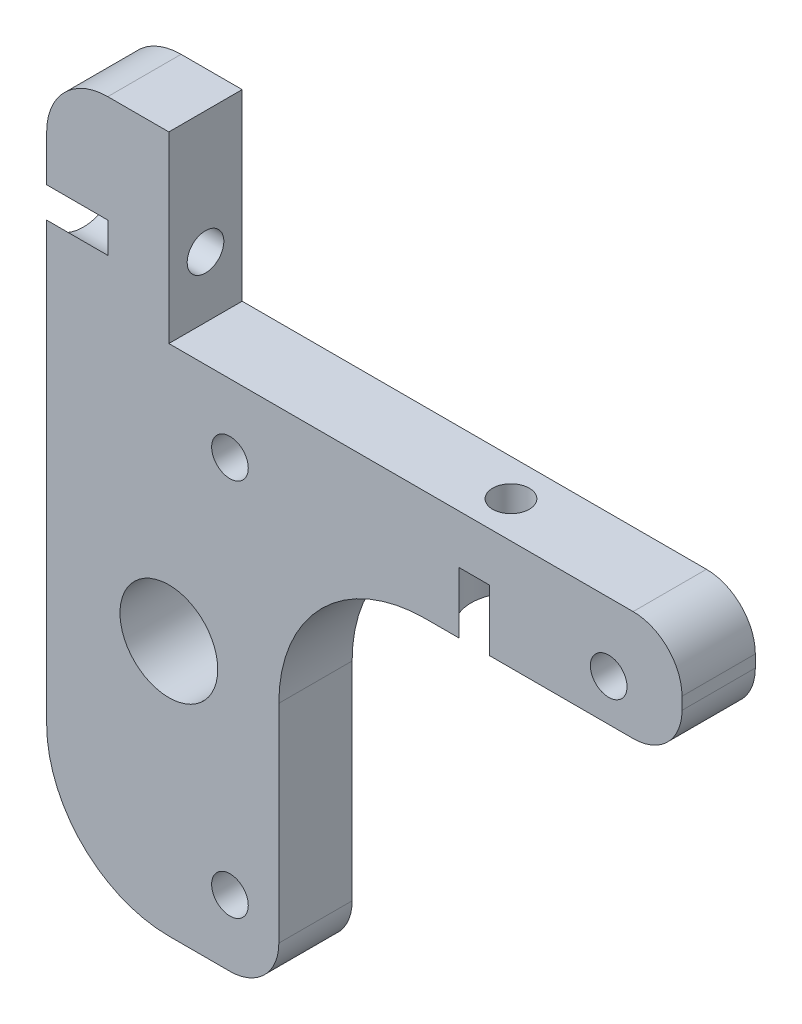
ISO-10303-21;
HEADER;
FILE_DESCRIPTION(('STEP AP214'),'2;1');
FILE_NAME('part.step','',(''),(''),'','','');
FILE_SCHEMA(('AUTOMOTIVE_DESIGN { 1 0 10303 214 1 1 1 1 }'));
ENDSEC;
DATA;
#1=APPLICATION_CONTEXT('core data for automotive mechanical design processes');
#2=APPLICATION_PROTOCOL_DEFINITION('international standard','automotive_design',2000,#1);
#3=PRODUCT_CONTEXT('',#1,'mechanical');
#4=PRODUCT('Part','Part','',(#3));
#5=PRODUCT_RELATED_PRODUCT_CATEGORY('part','',(#4));
#6=PRODUCT_DEFINITION_FORMATION('','',#4);
#7=PRODUCT_DEFINITION_CONTEXT('part definition',#1,'design');
#8=PRODUCT_DEFINITION('design','',#6,#7);
#9=PRODUCT_DEFINITION_SHAPE('','',#8);
#10=(LENGTH_UNIT() NAMED_UNIT(*) SI_UNIT(.MILLI.,.METRE.));
#11=(NAMED_UNIT(*) PLANE_ANGLE_UNIT() SI_UNIT($,.RADIAN.));
#12=(NAMED_UNIT(*) SI_UNIT($,.STERADIAN.) SOLID_ANGLE_UNIT());
#13=UNCERTAINTY_MEASURE_WITH_UNIT(LENGTH_MEASURE(1.E-05),#10,'distance_accuracy_value','');
#14=(GEOMETRIC_REPRESENTATION_CONTEXT(3) GLOBAL_UNCERTAINTY_ASSIGNED_CONTEXT((#13)) GLOBAL_UNIT_ASSIGNED_CONTEXT((#10,
#11,#12)) REPRESENTATION_CONTEXT('',''));
#15=CARTESIAN_POINT('',(0.,0.,0.));
#16=DIRECTION('',(0.,0.,1.));
#17=DIRECTION('',(1.,0.,0.));
#18=AXIS2_PLACEMENT_3D('',#15,#16,#17);
#19=CARTESIAN_POINT('',(-9.99999999999999,-31.9999999999999,6.));
#20=DIRECTION('',(1.,0.,0.));
#21=DIRECTION('',(0.,1.,0.));
#22=AXIS2_PLACEMENT_3D('',#19,#20,#21);
#23=PLANE('',#22);
#24=DIRECTION('',(0.,-1.,0.));
#25=VECTOR('',#24,1.);
#26=CARTESIAN_POINT('',(-9.99999999999999,-31.9999999999999,6.));
#27=LINE('',#26,#25);
#28=CARTESIAN_POINT('',(-9.99999999999999,3.75,6.));
#29=VERTEX_POINT('',#28);
#30=CARTESIAN_POINT('',(-10.,-31.9999999999999,6.));
#31=VERTEX_POINT('',#30);
#32=EDGE_CURVE('E343',#29,#31,#27,.T.);
#33=ORIENTED_EDGE('',*,*,#32,.F.);
#34=CARTESIAN_POINT('',(-9.99999999999999,5.,3.));
#35=DIRECTION('',(-1.,0.,0.));
#36=DIRECTION('',(0.,0.,1.));
#37=AXIS2_PLACEMENT_3D('',#34,#35,#36);
#38=CIRCLE('',#37,3.25);
#39=CARTESIAN_POINT('',(-9.99999999999999,3.75,0.));
#40=VERTEX_POINT('',#39);
#41=EDGE_CURVE('E193',#40,#29,#38,.T.);
#42=ORIENTED_EDGE('',*,*,#41,.F.);
#43=DIRECTION('',(0.,-1.,0.));
#44=VECTOR('',#43,1.);
#45=CARTESIAN_POINT('',(-9.99999999999999,-31.9999999999999,0.));
#46=LINE('',#45,#44);
#47=CARTESIAN_POINT('',(-10.,-31.9999999999999,0.));
#48=VERTEX_POINT('',#47);
#49=EDGE_CURVE('E212',#40,#48,#46,.T.);
#50=ORIENTED_EDGE('',*,*,#49,.T.);
#51=DIRECTION('',(0.,0.,-1.));
#52=VECTOR('',#51,1.);
#53=CARTESIAN_POINT('',(-10.,-31.9999999999999,6.));
#54=LINE('',#53,#52);
#55=EDGE_CURVE('E271',#31,#48,#54,.T.);
#56=ORIENTED_EDGE('',*,*,#55,.F.);
#57=EDGE_LOOP('',(#33,#42,#50,#56));
#58=FACE_BOUND('',#57,.T.);
#59=ADVANCED_FACE('F33',(#58),#23,.F.);
#60=CARTESIAN_POINT('',(42.,5.,3.));
#61=DIRECTION('',(-1.,0.,0.));
#62=DIRECTION('',(0.,0.,1.));
#63=AXIS2_PLACEMENT_3D('',#60,#61,#62);
#64=CYLINDRICAL_SURFACE('',#63,1.5);
#65=CARTESIAN_POINT('',(0.,5.,3.));
#66=DIRECTION('',(-1.,0.,0.));
#67=DIRECTION('',(0.,-1.,0.));
#68=AXIS2_PLACEMENT_3D('',#65,#66,#67);
#69=CIRCLE('',#68,1.5);
#70=CARTESIAN_POINT('',(0.,5.,4.5));
#71=VERTEX_POINT('',#70);
#72=EDGE_CURVE('E280',#71,#71,#69,.T.);
#73=CARTESIAN_POINT('',(-4.99999999999999,5.,3.));
#74=DIRECTION('',(-1.,0.,0.));
#75=DIRECTION('',(0.,0.,1.));
#76=AXIS2_PLACEMENT_3D('',#73,#74,#75);
#77=CIRCLE('',#76,1.5);
#78=CARTESIAN_POINT('',(-4.99999999999999,5.,4.5));
#79=VERTEX_POINT('',#78);
#80=EDGE_CURVE('E37',#79,#79,#77,.F.);
#81=CARTESIAN_POINT('',(0.,5.,4.5));
#82=CARTESIAN_POINT('',(-0.0520833333333322,5.,4.5));
#83=CARTESIAN_POINT('',(-0.104166666666664,5.,4.5));
#84=CARTESIAN_POINT('',(-0.208333333333331,5.,4.5));
#85=CARTESIAN_POINT('',(-0.260416666666666,5.,4.5));
#86=CARTESIAN_POINT('',(-0.364583333333332,5.,4.5));
#87=CARTESIAN_POINT('',(-0.416666666666665,5.,4.5));
#88=CARTESIAN_POINT('',(-0.520833333333331,5.,4.5));
#89=CARTESIAN_POINT('',(-0.572916666666666,5.,4.5));
#90=CARTESIAN_POINT('',(-0.677083333333333,5.,4.5));
#91=CARTESIAN_POINT('',(-0.729166666666665,5.,4.5));
#92=CARTESIAN_POINT('',(-0.833333333333332,5.,4.5));
#93=CARTESIAN_POINT('',(-0.885416666666666,5.,4.5));
#94=CARTESIAN_POINT('',(-0.989583333333333,5.,4.5));
#95=CARTESIAN_POINT('',(-1.04166666666667,5.,4.5));
#96=CARTESIAN_POINT('',(-1.14583333333333,5.,4.5));
#97=CARTESIAN_POINT('',(-1.19791666666667,5.,4.5));
#98=CARTESIAN_POINT('',(-1.30208333333333,5.,4.5));
#99=CARTESIAN_POINT('',(-1.35416666666667,5.,4.5));
#100=CARTESIAN_POINT('',(-1.45833333333333,5.,4.5));
#101=CARTESIAN_POINT('',(-1.51041666666666,5.,4.5));
#102=CARTESIAN_POINT('',(-1.61458333333333,5.,4.5));
#103=CARTESIAN_POINT('',(-1.66666666666666,5.,4.5));
#104=CARTESIAN_POINT('',(-1.77083333333333,5.,4.5));
#105=CARTESIAN_POINT('',(-1.82291666666666,5.,4.5));
#106=CARTESIAN_POINT('',(-1.92708333333333,5.,4.5));
#107=CARTESIAN_POINT('',(-1.97916666666666,5.,4.5));
#108=CARTESIAN_POINT('',(-2.08333333333333,5.,4.5));
#109=CARTESIAN_POINT('',(-2.13541666666666,5.,4.5));
#110=CARTESIAN_POINT('',(-2.23958333333333,5.,4.5));
#111=CARTESIAN_POINT('',(-2.29166666666666,5.,4.5));
#112=CARTESIAN_POINT('',(-2.39583333333333,5.,4.5));
#113=CARTESIAN_POINT('',(-2.44791666666666,5.,4.5));
#114=CARTESIAN_POINT('',(-2.55208333333333,5.,4.5));
#115=CARTESIAN_POINT('',(-2.60416666666666,5.,4.5));
#116=CARTESIAN_POINT('',(-2.70833333333333,5.,4.5));
#117=CARTESIAN_POINT('',(-2.76041666666666,5.,4.5));
#118=CARTESIAN_POINT('',(-2.86458333333333,5.,4.5));
#119=CARTESIAN_POINT('',(-2.91666666666666,5.,4.5));
#120=CARTESIAN_POINT('',(-3.02083333333333,5.,4.5));
#121=CARTESIAN_POINT('',(-3.07291666666666,5.,4.5));
#122=CARTESIAN_POINT('',(-3.17708333333333,5.,4.5));
#123=CARTESIAN_POINT('',(-3.22916666666666,5.,4.5));
#124=CARTESIAN_POINT('',(-3.33333333333333,5.,4.5));
#125=CARTESIAN_POINT('',(-3.38541666666666,5.,4.5));
#126=CARTESIAN_POINT('',(-3.48958333333333,5.,4.5));
#127=CARTESIAN_POINT('',(-3.54166666666666,5.,4.5));
#128=CARTESIAN_POINT('',(-3.64583333333333,5.,4.5));
#129=CARTESIAN_POINT('',(-3.69791666666666,5.,4.5));
#130=CARTESIAN_POINT('',(-3.80208333333332,5.,4.5));
#131=CARTESIAN_POINT('',(-3.85416666666666,5.,4.5));
#132=CARTESIAN_POINT('',(-3.95833333333333,5.,4.5));
#133=CARTESIAN_POINT('',(-4.01041666666666,5.,4.5));
#134=CARTESIAN_POINT('',(-4.11458333333332,5.,4.5));
#135=CARTESIAN_POINT('',(-4.16666666666666,5.,4.5));
#136=CARTESIAN_POINT('',(-4.27083333333333,5.,4.5));
#137=CARTESIAN_POINT('',(-4.32291666666666,5.,4.5));
#138=CARTESIAN_POINT('',(-4.42708333333332,5.,4.5));
#139=CARTESIAN_POINT('',(-4.47916666666666,5.,4.5));
#140=CARTESIAN_POINT('',(-4.58333333333333,5.,4.5));
#141=CARTESIAN_POINT('',(-4.63541666666666,5.,4.5));
#142=CARTESIAN_POINT('',(-4.73958333333333,5.,4.5));
#143=CARTESIAN_POINT('',(-4.79166666666666,5.,4.5));
#144=CARTESIAN_POINT('',(-4.89583333333333,5.,4.5));
#145=CARTESIAN_POINT('',(-4.94791666666666,5.,4.5));
#146=CARTESIAN_POINT('',(-4.99999999999999,5.,4.5));
#147=B_SPLINE_CURVE_WITH_KNOTS('',3,(#81,#82,#83,#84,#85,#86,#87,#88,#89,#90,#91,#92,#93,#94,
#95,#96,#97,#98,#99,#100,#101,#102,#103,#104,#105,#106,#107,#108,#109,#110,#111,#112,#113,#114,
#115,#116,#117,#118,#119,#120,#121,#122,#123,#124,#125,#126,#127,#128,#129,#130,#131,#132,#133,
#134,#135,#136,#137,#138,#139,#140,#141,#142,#143,#144,#145,#146),.UNSPECIFIED.,.F.,.F.,(4,2,2,
2,2,2,2,2,2,2,2,2,2,2,2,2,2,2,2,2,2,2,2,2,2,2,2,2,2,2,2,2,4),(0.,0.156249999999997,0.3125,
0.468749999999997,0.625000000000001,0.781249999999997,0.937500000000001,1.09375,1.25,1.40625,
1.56249999999999,1.71875,1.87499999999999,2.03125,2.1875,2.34375,2.5,2.65624999999999,2.8125,
2.96874999999999,3.125,3.28124999999999,3.4375,3.59374999999999,3.74999999999999,
3.90624999999999,4.06249999999999,4.21874999999999,4.37499999999999,4.53124999999999,
4.68749999999999,4.84374999999999,4.99999999999999),.UNSPECIFIED.);
#148=EDGE_CURVE('BSEAM467',#71,#79,#147,.T.);
#149=ORIENTED_EDGE('',*,*,#72,.F.);
#150=ORIENTED_EDGE('',*,*,#80,.F.);
#151=ORIENTED_EDGE('',*,*,#148,.T.);
#152=ORIENTED_EDGE('',*,*,#148,.F.);
#153=EDGE_LOOP('',(#149,#151,#150,#152));
#154=FACE_BOUND('',#153,.T.);
#155=ADVANCED_FACE('F467',(#154),#64,.F.);
#156=CARTESIAN_POINT('',(38.,-9.,6.));
#157=DIRECTION('',(0.,1.,0.));
#158=DIRECTION('',(-1.,0.,0.));
#159=AXIS2_PLACEMENT_3D('',#156,#157,#158);
#160=PLANE('',#159);
#161=DIRECTION('',(1.,0.,0.));
#162=VECTOR('',#161,1.);
#163=CARTESIAN_POINT('',(38.,-9.,6.));
#164=LINE('',#163,#162);
#165=CARTESIAN_POINT('',(26.25,-9.,6.));
#166=VERTEX_POINT('',#165);
#167=CARTESIAN_POINT('',(38.,-9.,6.));
#168=VERTEX_POINT('',#167);
#169=EDGE_CURVE('E356',#166,#168,#164,.T.);
#170=ORIENTED_EDGE('',*,*,#169,.F.);
#171=CARTESIAN_POINT('',(25.,-9.,3.));
#172=DIRECTION('',(0.,-1.,0.));
#173=DIRECTION('',(1.,0.,0.));
#174=AXIS2_PLACEMENT_3D('',#171,#172,#173);
#175=CIRCLE('',#174,3.25);
#176=CARTESIAN_POINT('',(26.25,-9.,0.));
#177=VERTEX_POINT('',#176);
#178=EDGE_CURVE('E300',#177,#166,#175,.T.);
#179=ORIENTED_EDGE('',*,*,#178,.F.);
#180=DIRECTION('',(1.,0.,0.));
#181=VECTOR('',#180,1.);
#182=CARTESIAN_POINT('',(38.,-9.,0.));
#183=LINE('',#182,#181);
#184=CARTESIAN_POINT('',(38.,-9.,0.));
#185=VERTEX_POINT('',#184);
#186=EDGE_CURVE('E227',#177,#185,#183,.T.);
#187=ORIENTED_EDGE('',*,*,#186,.T.);
#188=DIRECTION('',(0.,0.,-1.));
#189=VECTOR('',#188,1.);
#190=CARTESIAN_POINT('',(38.,-9.,6.));
#191=LINE('',#190,#189);
#192=EDGE_CURVE('E253',#168,#185,#191,.T.);
#193=ORIENTED_EDGE('',*,*,#192,.F.);
#194=EDGE_LOOP('',(#170,#179,#187,#193));
#195=FACE_BOUND('',#194,.T.);
#196=ADVANCED_FACE('F405',(#195),#160,.F.);
#197=CARTESIAN_POINT('',(25.,15.,3.));
#198=DIRECTION('',(0.,-1.,0.));
#199=DIRECTION('',(1.,0.,0.));
#200=AXIS2_PLACEMENT_3D('',#197,#198,#199);
#201=CYLINDRICAL_SURFACE('',#200,1.5);
#202=CARTESIAN_POINT('',(25.,0.,3.));
#203=DIRECTION('',(0.,-1.,0.));
#204=DIRECTION('',(0.,0.,-1.));
#205=AXIS2_PLACEMENT_3D('',#202,#203,#204);
#206=CIRCLE('',#205,1.5);
#207=CARTESIAN_POINT('',(25.,0.,1.5));
#208=VERTEX_POINT('',#207);
#209=EDGE_CURVE('E277',#208,#208,#206,.T.);
#210=ORIENTED_EDGE('',*,*,#209,.F.);
#211=EDGE_LOOP('',(#210));
#212=FACE_BOUND('',#211,.T.);
#213=CARTESIAN_POINT('',(25.,-4.,3.));
#214=DIRECTION('',(0.,-1.,0.));
#215=DIRECTION('',(1.,0.,0.));
#216=AXIS2_PLACEMENT_3D('',#213,#214,#215);
#217=CIRCLE('',#216,1.5);
#218=CARTESIAN_POINT('',(26.5,-4.,3.));
#219=VERTEX_POINT('',#218);
#220=EDGE_CURVE('E281',#219,#219,#217,.F.);
#221=ORIENTED_EDGE('',*,*,#220,.F.);
#222=EDGE_LOOP('',(#221));
#223=FACE_BOUND('',#222,.T.);
#224=ADVANCED_FACE('F475',(#212,#223),#201,.F.);
#225=CARTESIAN_POINT('',(38.,-4.,6.));
#226=DIRECTION('',(0.,0.,-1.));
#227=DIRECTION('',(-1.,0.,0.));
#228=AXIS2_PLACEMENT_3D('',#225,#226,#227);
#229=PLANE('',#228);
#230=CARTESIAN_POINT('',(5.,-36.58,6.));
#231=DIRECTION('',(0.,0.,1.));
#232=DIRECTION('',(1.,0.,0.));
#233=AXIS2_PLACEMENT_3D('',#230,#231,#232);
#234=CIRCLE('',#233,1.5);
#235=CARTESIAN_POINT('',(6.5,-36.58,6.));
#236=VERTEX_POINT('',#235);
#237=EDGE_CURVE('E319',#236,#236,#234,.T.);
#238=ORIENTED_EDGE('',*,*,#237,.F.);
#239=EDGE_LOOP('',(#238));
#240=FACE_BOUND('',#239,.T.);
#241=CARTESIAN_POINT('',(36.,-5.57999999999999,6.));
#242=DIRECTION('',(0.,0.,1.));
#243=DIRECTION('',(1.,0.,0.));
#244=AXIS2_PLACEMENT_3D('',#241,#242,#243);
#245=CIRCLE('',#244,1.5);
#246=CARTESIAN_POINT('',(37.5,-5.57999999999999,6.));
#247=VERTEX_POINT('',#246);
#248=EDGE_CURVE('E331',#247,#247,#245,.T.);
#249=ORIENTED_EDGE('',*,*,#248,.F.);
#250=EDGE_LOOP('',(#249));
#251=FACE_BOUND('',#250,.T.);
#252=DIRECTION('',(0.,1.,0.));
#253=VECTOR('',#252,1.);
#254=CARTESIAN_POINT('',(-4.99999999999999,-4.,6.));
#255=LINE('',#254,#253);
#256=CARTESIAN_POINT('',(-4.99999999999999,3.75,6.));
#257=VERTEX_POINT('',#256);
#258=CARTESIAN_POINT('',(-4.99999999999999,6.25,6.));
#259=VERTEX_POINT('',#258);
#260=EDGE_CURVE('E205',#257,#259,#255,.T.);
#261=ORIENTED_EDGE('',*,*,#260,.F.);
#262=DIRECTION('',(-1.,0.,0.));
#263=VECTOR('',#262,1.);
#264=CARTESIAN_POINT('',(-4.99999999999999,3.75,6.));
#265=LINE('',#264,#263);
#266=EDGE_CURVE('E298',#257,#29,#265,.T.);
#267=ORIENTED_EDGE('',*,*,#266,.T.);
#268=ORIENTED_EDGE('',*,*,#32,.T.);
#269=CARTESIAN_POINT('',(0.,-32.,6.));
#270=DIRECTION('',(0.,0.,1.));
#271=DIRECTION('',(-1.,0.,0.));
#272=AXIS2_PLACEMENT_3D('',#269,#270,#271);
#273=CIRCLE('',#272,10.);
#274=CARTESIAN_POINT('',(0.,-42.,6.));
#275=VERTEX_POINT('',#274);
#276=EDGE_CURVE('E346',#31,#275,#273,.T.);
#277=ORIENTED_EDGE('',*,*,#276,.T.);
#278=DIRECTION('',(1.,0.,0.));
#279=VECTOR('',#278,1.);
#280=CARTESIAN_POINT('',(5.00000000000001,-42.,6.));
#281=LINE('',#280,#279);
#282=CARTESIAN_POINT('',(5.00000000000001,-42.,6.));
#283=VERTEX_POINT('',#282);
#284=EDGE_CURVE('E348',#275,#283,#281,.T.);
#285=ORIENTED_EDGE('',*,*,#284,.T.);
#286=CARTESIAN_POINT('',(5.00000000000001,-38.,6.));
#287=DIRECTION('',(0.,0.,1.));
#288=DIRECTION('',(-1.,0.,0.));
#289=AXIS2_PLACEMENT_3D('',#286,#287,#288);
#290=CIRCLE('',#289,4.);
#291=CARTESIAN_POINT('',(9.00000000000001,-38.,6.));
#292=VERTEX_POINT('',#291);
#293=EDGE_CURVE('E350',#283,#292,#290,.T.);
#294=ORIENTED_EDGE('',*,*,#293,.T.);
#295=DIRECTION('',(0.,1.,0.));
#296=VECTOR('',#295,1.);
#297=CARTESIAN_POINT('',(9.00000000000001,-21.,6.));
#298=LINE('',#297,#296);
#299=CARTESIAN_POINT('',(9.00000000000001,-21.,6.));
#300=VERTEX_POINT('',#299);
#301=EDGE_CURVE('E352',#292,#300,#298,.T.);
#302=ORIENTED_EDGE('',*,*,#301,.T.);
#303=CARTESIAN_POINT('',(21.,-21.,6.));
#304=DIRECTION('',(0.,0.,-1.));
#305=DIRECTION('',(-1.,0.,0.));
#306=AXIS2_PLACEMENT_3D('',#303,#304,#305);
#307=CIRCLE('',#306,12.);
#308=CARTESIAN_POINT('',(21.,-9.,6.));
#309=VERTEX_POINT('',#308);
#310=EDGE_CURVE('E354',#300,#309,#307,.T.);
#311=ORIENTED_EDGE('',*,*,#310,.T.);
#312=CARTESIAN_POINT('',(23.75,-9.,6.));
#313=VERTEX_POINT('',#312);
#314=EDGE_CURVE('E357',#309,#313,#164,.T.);
#315=ORIENTED_EDGE('',*,*,#314,.T.);
#316=DIRECTION('',(0.,-1.,0.));
#317=VECTOR('',#316,1.);
#318=CARTESIAN_POINT('',(23.75,-4.,6.));
#319=LINE('',#318,#317);
#320=CARTESIAN_POINT('',(23.75,-4.,6.));
#321=VERTEX_POINT('',#320);
#322=EDGE_CURVE('E58',#313,#321,#319,.F.);
#323=ORIENTED_EDGE('',*,*,#322,.T.);
#324=DIRECTION('',(-1.,0.,0.));
#325=VECTOR('',#324,1.);
#326=CARTESIAN_POINT('',(38.,-4.,6.));
#327=LINE('',#326,#325);
#328=CARTESIAN_POINT('',(26.25,-4.,6.));
#329=VERTEX_POINT('',#328);
#330=EDGE_CURVE('E288',#329,#321,#327,.T.);
#331=ORIENTED_EDGE('',*,*,#330,.F.);
#332=DIRECTION('',(0.,-1.,0.));
#333=VECTOR('',#332,1.);
#334=CARTESIAN_POINT('',(26.25,-4.,6.));
#335=LINE('',#334,#333);
#336=EDGE_CURVE('E308',#329,#166,#335,.T.);
#337=ORIENTED_EDGE('',*,*,#336,.T.);
#338=ORIENTED_EDGE('',*,*,#169,.T.);
#339=CARTESIAN_POINT('',(38.,-5.,6.));
#340=DIRECTION('',(0.,0.,1.));
#341=DIRECTION('',(-1.,0.,0.));
#342=AXIS2_PLACEMENT_3D('',#339,#340,#341);
#343=CIRCLE('',#342,4.);
#344=CARTESIAN_POINT('',(42.,-5.,6.));
#345=VERTEX_POINT('',#344);
#346=EDGE_CURVE('E360',#168,#345,#343,.T.);
#347=ORIENTED_EDGE('',*,*,#346,.T.);
#348=DIRECTION('',(0.,1.,0.));
#349=VECTOR('',#348,1.);
#350=CARTESIAN_POINT('',(42.,-4.00000000000003,6.));
#351=LINE('',#350,#349);
#352=CARTESIAN_POINT('',(42.,-4.00000000000003,6.));
#353=VERTEX_POINT('',#352);
#354=EDGE_CURVE('E362',#345,#353,#351,.T.);
#355=ORIENTED_EDGE('',*,*,#354,.T.);
#356=CARTESIAN_POINT('',(38.,-4.,6.));
#357=DIRECTION('',(0.,0.,1.));
#358=DIRECTION('',(-1.,0.,0.));
#359=AXIS2_PLACEMENT_3D('',#356,#357,#358);
#360=CIRCLE('',#359,4.);
#361=CARTESIAN_POINT('',(38.,0.,6.));
#362=VERTEX_POINT('',#361);
#363=EDGE_CURVE('E364',#353,#362,#360,.T.);
#364=ORIENTED_EDGE('',*,*,#363,.T.);
#365=DIRECTION('',(-1.,0.,0.));
#366=VECTOR('',#365,1.);
#367=CARTESIAN_POINT('',(0.,0.,6.));
#368=LINE('',#367,#366);
#369=CARTESIAN_POINT('',(0.,0.,6.));
#370=VERTEX_POINT('',#369);
#371=EDGE_CURVE('E244',#362,#370,#368,.T.);
#372=ORIENTED_EDGE('',*,*,#371,.T.);
#373=DIRECTION('',(0.,1.,0.));
#374=VECTOR('',#373,1.);
#375=CARTESIAN_POINT('',(0.,15.,6.));
#376=LINE('',#375,#374);
#377=CARTESIAN_POINT('',(0.,15.,6.));
#378=VERTEX_POINT('',#377);
#379=EDGE_CURVE('E239',#370,#378,#376,.T.);
#380=ORIENTED_EDGE('',*,*,#379,.T.);
#381=DIRECTION('',(-1.,0.,0.));
#382=VECTOR('',#381,1.);
#383=CARTESIAN_POINT('',(-4.99999999999996,15.,6.));
#384=LINE('',#383,#382);
#385=CARTESIAN_POINT('',(-4.99999999999996,15.,6.));
#386=VERTEX_POINT('',#385);
#387=EDGE_CURVE('E339',#378,#386,#384,.T.);
#388=ORIENTED_EDGE('',*,*,#387,.T.);
#389=CARTESIAN_POINT('',(-4.99999999999999,10.,6.));
#390=DIRECTION('',(0.,0.,1.));
#391=DIRECTION('',(-1.,0.,0.));
#392=AXIS2_PLACEMENT_3D('',#389,#390,#391);
#393=CIRCLE('',#392,5.);
#394=CARTESIAN_POINT('',(-9.99999999999999,9.99999999999996,6.));
#395=VERTEX_POINT('',#394);
#396=EDGE_CURVE('E341',#386,#395,#393,.T.);
#397=ORIENTED_EDGE('',*,*,#396,.T.);
#398=CARTESIAN_POINT('',(-9.99999999999999,6.25,6.));
#399=VERTEX_POINT('',#398);
#400=EDGE_CURVE('E344',#395,#399,#27,.T.);
#401=ORIENTED_EDGE('',*,*,#400,.T.);
#402=DIRECTION('',(-1.,0.,0.));
#403=VECTOR('',#402,1.);
#404=CARTESIAN_POINT('',(-4.99999999999999,6.25,6.));
#405=LINE('',#404,#403);
#406=EDGE_CURVE('E50',#399,#259,#405,.F.);
#407=ORIENTED_EDGE('',*,*,#406,.T.);
#408=EDGE_LOOP('',(#261,#267,#268,#277,#285,#294,#302,#311,#315,#323,#331,#337,#338,#347,#355,
#364,#372,#380,#388,#397,#401,#407));
#409=FACE_BOUND('',#408,.T.);
#410=CARTESIAN_POINT('',(5.,-5.58,6.));
#411=DIRECTION('',(0.,0.,1.));
#412=DIRECTION('',(1.,0.,0.));
#413=AXIS2_PLACEMENT_3D('',#410,#411,#412);
#414=CIRCLE('',#413,1.5);
#415=CARTESIAN_POINT('',(6.5,-5.58,6.));
#416=VERTEX_POINT('',#415);
#417=EDGE_CURVE('E325',#416,#416,#414,.T.);
#418=ORIENTED_EDGE('',*,*,#417,.F.);
#419=EDGE_LOOP('',(#418));
#420=FACE_BOUND('',#419,.T.);
#421=CARTESIAN_POINT('',(0.,-21.1,6.));
#422=DIRECTION('',(0.,0.,1.));
#423=DIRECTION('',(1.,0.,0.));
#424=AXIS2_PLACEMENT_3D('',#421,#422,#423);
#425=CIRCLE('',#424,4.);
#426=CARTESIAN_POINT('',(4.,-21.1,6.));
#427=VERTEX_POINT('',#426);
#428=EDGE_CURVE('E313',#427,#427,#425,.T.);
#429=ORIENTED_EDGE('',*,*,#428,.F.);
#430=EDGE_LOOP('',(#429));
#431=FACE_BOUND('',#430,.T.);
#432=ADVANCED_FACE('F412',(#240,#251,#409,#420,#431),#229,.F.);
#433=CARTESIAN_POINT('',(38.,-4.,0.));
#434=DIRECTION('',(0.,0.,-1.));
#435=DIRECTION('',(-1.,0.,0.));
#436=AXIS2_PLACEMENT_3D('',#433,#434,#435);
#437=PLANE('',#436);
#438=DIRECTION('',(-1.,0.,0.));
#439=VECTOR('',#438,1.);
#440=CARTESIAN_POINT('',(-4.99999999999999,3.75,0.));
#441=LINE('',#440,#439);
#442=CARTESIAN_POINT('',(-4.99999999999999,3.75,0.));
#443=VERTEX_POINT('',#442);
#444=EDGE_CURVE('E204',#443,#40,#441,.T.);
#445=ORIENTED_EDGE('',*,*,#444,.F.);
#446=DIRECTION('',(0.,1.,0.));
#447=VECTOR('',#446,1.);
#448=CARTESIAN_POINT('',(-4.99999999999999,-4.,0.));
#449=LINE('',#448,#447);
#450=CARTESIAN_POINT('',(-4.99999999999999,6.25,0.));
#451=VERTEX_POINT('',#450);
#452=EDGE_CURVE('E203',#443,#451,#449,.T.);
#453=ORIENTED_EDGE('',*,*,#452,.T.);
#454=DIRECTION('',(-1.,0.,0.));
#455=VECTOR('',#454,1.);
#456=CARTESIAN_POINT('',(-4.99999999999999,6.25,0.));
#457=LINE('',#456,#455);
#458=CARTESIAN_POINT('',(-9.99999999999999,6.25,0.));
#459=VERTEX_POINT('',#458);
#460=EDGE_CURVE('E186',#459,#451,#457,.F.);
#461=ORIENTED_EDGE('',*,*,#460,.F.);
#462=CARTESIAN_POINT('',(-9.99999999999999,9.99999999999996,0.));
#463=VERTEX_POINT('',#462);
#464=EDGE_CURVE('E202',#463,#459,#46,.T.);
#465=ORIENTED_EDGE('',*,*,#464,.F.);
#466=CARTESIAN_POINT('',(-4.99999999999999,10.,0.));
#467=DIRECTION('',(0.,0.,1.));
#468=DIRECTION('',(-1.,0.,0.));
#469=AXIS2_PLACEMENT_3D('',#466,#467,#468);
#470=CIRCLE('',#469,5.);
#471=CARTESIAN_POINT('',(-4.99999999999996,15.,0.));
#472=VERTEX_POINT('',#471);
#473=EDGE_CURVE('E216',#472,#463,#470,.T.);
#474=ORIENTED_EDGE('',*,*,#473,.F.);
#475=DIRECTION('',(-1.,0.,0.));
#476=VECTOR('',#475,1.);
#477=CARTESIAN_POINT('',(-4.99999999999996,15.,0.));
#478=LINE('',#477,#476);
#479=CARTESIAN_POINT('',(0.,15.,0.));
#480=VERTEX_POINT('',#479);
#481=EDGE_CURVE('E368',#480,#472,#478,.T.);
#482=ORIENTED_EDGE('',*,*,#481,.F.);
#483=DIRECTION('',(0.,1.,0.));
#484=VECTOR('',#483,1.);
#485=CARTESIAN_POINT('',(0.,15.,0.));
#486=LINE('',#485,#484);
#487=CARTESIAN_POINT('',(0.,0.,0.));
#488=VERTEX_POINT('',#487);
#489=EDGE_CURVE('E334',#488,#480,#486,.T.);
#490=ORIENTED_EDGE('',*,*,#489,.F.);
#491=DIRECTION('',(-1.,0.,0.));
#492=VECTOR('',#491,1.);
#493=CARTESIAN_POINT('',(0.,0.,0.));
#494=LINE('',#493,#492);
#495=CARTESIAN_POINT('',(38.,0.,0.));
#496=VERTEX_POINT('',#495);
#497=EDGE_CURVE('E237',#496,#488,#494,.T.);
#498=ORIENTED_EDGE('',*,*,#497,.F.);
#499=CARTESIAN_POINT('',(38.,-4.,0.));
#500=DIRECTION('',(0.,0.,1.));
#501=DIRECTION('',(-1.,0.,0.));
#502=AXIS2_PLACEMENT_3D('',#499,#500,#501);
#503=CIRCLE('',#502,4.);
#504=CARTESIAN_POINT('',(42.,-4.00000000000003,0.));
#505=VERTEX_POINT('',#504);
#506=EDGE_CURVE('E235',#505,#496,#503,.T.);
#507=ORIENTED_EDGE('',*,*,#506,.F.);
#508=DIRECTION('',(0.,1.,0.));
#509=VECTOR('',#508,1.);
#510=CARTESIAN_POINT('',(42.,-4.00000000000003,0.));
#511=LINE('',#510,#509);
#512=CARTESIAN_POINT('',(42.,-5.,0.));
#513=VERTEX_POINT('',#512);
#514=EDGE_CURVE('E233',#513,#505,#511,.T.);
#515=ORIENTED_EDGE('',*,*,#514,.F.);
#516=CARTESIAN_POINT('',(38.,-5.,0.));
#517=DIRECTION('',(0.,0.,1.));
#518=DIRECTION('',(-1.,0.,0.));
#519=AXIS2_PLACEMENT_3D('',#516,#517,#518);
#520=CIRCLE('',#519,4.);
#521=EDGE_CURVE('E231',#185,#513,#520,.T.);
#522=ORIENTED_EDGE('',*,*,#521,.F.);
#523=ORIENTED_EDGE('',*,*,#186,.F.);
#524=DIRECTION('',(0.,-1.,0.));
#525=VECTOR('',#524,1.);
#526=CARTESIAN_POINT('',(26.25,-4.,0.));
#527=LINE('',#526,#525);
#528=CARTESIAN_POINT('',(26.25,-4.,0.));
#529=VERTEX_POINT('',#528);
#530=EDGE_CURVE('E305',#529,#177,#527,.T.);
#531=ORIENTED_EDGE('',*,*,#530,.F.);
#532=DIRECTION('',(-1.,0.,0.));
#533=VECTOR('',#532,1.);
#534=CARTESIAN_POINT('',(38.,-4.,0.));
#535=LINE('',#534,#533);
#536=CARTESIAN_POINT('',(23.75,-4.,0.));
#537=VERTEX_POINT('',#536);
#538=EDGE_CURVE('E283',#529,#537,#535,.T.);
#539=ORIENTED_EDGE('',*,*,#538,.T.);
#540=DIRECTION('',(0.,-1.,0.));
#541=VECTOR('',#540,1.);
#542=CARTESIAN_POINT('',(23.75,-4.,0.));
#543=LINE('',#542,#541);
#544=CARTESIAN_POINT('',(23.75,-9.,0.));
#545=VERTEX_POINT('',#544);
#546=EDGE_CURVE('E303',#545,#537,#543,.F.);
#547=ORIENTED_EDGE('',*,*,#546,.F.);
#548=CARTESIAN_POINT('',(21.,-9.,0.));
#549=VERTEX_POINT('',#548);
#550=EDGE_CURVE('E228',#549,#545,#183,.T.);
#551=ORIENTED_EDGE('',*,*,#550,.F.);
#552=CARTESIAN_POINT('',(21.,-21.,0.));
#553=DIRECTION('',(0.,0.,-1.));
#554=DIRECTION('',(-1.,0.,0.));
#555=AXIS2_PLACEMENT_3D('',#552,#553,#554);
#556=CIRCLE('',#555,12.);
#557=CARTESIAN_POINT('',(9.00000000000001,-21.,0.));
#558=VERTEX_POINT('',#557);
#559=EDGE_CURVE('E225',#558,#549,#556,.T.);
#560=ORIENTED_EDGE('',*,*,#559,.F.);
#561=DIRECTION('',(0.,1.,0.));
#562=VECTOR('',#561,1.);
#563=CARTESIAN_POINT('',(9.00000000000001,-21.,0.));
#564=LINE('',#563,#562);
#565=CARTESIAN_POINT('',(9.00000000000001,-38.,0.));
#566=VERTEX_POINT('',#565);
#567=EDGE_CURVE('E223',#566,#558,#564,.T.);
#568=ORIENTED_EDGE('',*,*,#567,.F.);
#569=CARTESIAN_POINT('',(5.00000000000001,-38.,0.));
#570=DIRECTION('',(0.,0.,1.));
#571=DIRECTION('',(-1.,0.,0.));
#572=AXIS2_PLACEMENT_3D('',#569,#570,#571);
#573=CIRCLE('',#572,4.);
#574=CARTESIAN_POINT('',(5.00000000000001,-42.,0.));
#575=VERTEX_POINT('',#574);
#576=EDGE_CURVE('E221',#575,#566,#573,.T.);
#577=ORIENTED_EDGE('',*,*,#576,.F.);
#578=DIRECTION('',(1.,0.,0.));
#579=VECTOR('',#578,1.);
#580=CARTESIAN_POINT('',(5.00000000000001,-42.,0.));
#581=LINE('',#580,#579);
#582=CARTESIAN_POINT('',(0.,-42.,0.));
#583=VERTEX_POINT('',#582);
#584=EDGE_CURVE('E214',#583,#575,#581,.T.);
#585=ORIENTED_EDGE('',*,*,#584,.F.);
#586=CARTESIAN_POINT('',(0.,-32.,0.));
#587=DIRECTION('',(0.,0.,1.));
#588=DIRECTION('',(-1.,0.,0.));
#589=AXIS2_PLACEMENT_3D('',#586,#587,#588);
#590=CIRCLE('',#589,10.);
#591=EDGE_CURVE('E211',#48,#583,#590,.T.);
#592=ORIENTED_EDGE('',*,*,#591,.F.);
#593=ORIENTED_EDGE('',*,*,#49,.F.);
#594=EDGE_LOOP('',(#445,#453,#461,#465,#474,#482,#490,#498,#507,#515,#522,#523,#531,#539,#547,
#551,#560,#568,#577,#585,#592,#593));
#595=FACE_BOUND('',#594,.T.);
#596=CARTESIAN_POINT('',(5.,-36.58,0.));
#597=DIRECTION('',(0.,0.,1.));
#598=DIRECTION('',(1.,0.,0.));
#599=AXIS2_PLACEMENT_3D('',#596,#597,#598);
#600=CIRCLE('',#599,1.5);
#601=CARTESIAN_POINT('',(6.5,-36.58,0.));
#602=VERTEX_POINT('',#601);
#603=EDGE_CURVE('E316',#602,#602,#600,.T.);
#604=ORIENTED_EDGE('',*,*,#603,.T.);
#605=EDGE_LOOP('',(#604));
#606=FACE_BOUND('',#605,.T.);
#607=CARTESIAN_POINT('',(36.,-5.57999999999999,0.));
#608=DIRECTION('',(0.,0.,1.));
#609=DIRECTION('',(1.,0.,0.));
#610=AXIS2_PLACEMENT_3D('',#607,#608,#609);
#611=CIRCLE('',#610,1.5);
#612=CARTESIAN_POINT('',(37.5,-5.57999999999999,0.));
#613=VERTEX_POINT('',#612);
#614=EDGE_CURVE('E328',#613,#613,#611,.T.);
#615=ORIENTED_EDGE('',*,*,#614,.T.);
#616=EDGE_LOOP('',(#615));
#617=FACE_BOUND('',#616,.T.);
#618=CARTESIAN_POINT('',(5.,-5.58,0.));
#619=DIRECTION('',(0.,0.,1.));
#620=DIRECTION('',(1.,0.,0.));
#621=AXIS2_PLACEMENT_3D('',#618,#619,#620);
#622=CIRCLE('',#621,1.5);
#623=CARTESIAN_POINT('',(6.5,-5.58,0.));
#624=VERTEX_POINT('',#623);
#625=EDGE_CURVE('E322',#624,#624,#622,.T.);
#626=ORIENTED_EDGE('',*,*,#625,.T.);
#627=EDGE_LOOP('',(#626));
#628=FACE_BOUND('',#627,.T.);
#629=CARTESIAN_POINT('',(0.,-21.1,0.));
#630=DIRECTION('',(0.,0.,1.));
#631=DIRECTION('',(1.,0.,0.));
#632=AXIS2_PLACEMENT_3D('',#629,#630,#631);
#633=CIRCLE('',#632,4.);
#634=CARTESIAN_POINT('',(4.,-21.1,0.));
#635=VERTEX_POINT('',#634);
#636=EDGE_CURVE('E279',#635,#635,#633,.T.);
#637=ORIENTED_EDGE('',*,*,#636,.T.);
#638=EDGE_LOOP('',(#637));
#639=FACE_BOUND('',#638,.T.);
#640=ADVANCED_FACE('F199',(#595,#606,#617,#628,#639),#437,.T.);
#641=CARTESIAN_POINT('',(0.,15.,6.));
#642=DIRECTION('',(-1.,0.,0.));
#643=DIRECTION('',(0.,-1.,0.));
#644=AXIS2_PLACEMENT_3D('',#641,#642,#643);
#645=PLANE('',#644);
#646=ORIENTED_EDGE('',*,*,#72,.T.);
#647=EDGE_LOOP('',(#646));
#648=FACE_BOUND('',#647,.T.);
#649=ORIENTED_EDGE('',*,*,#489,.T.);
#650=DIRECTION('',(0.,0.,-1.));
#651=VECTOR('',#650,1.);
#652=CARTESIAN_POINT('',(0.,15.,6.));
#653=LINE('',#652,#651);
#654=EDGE_CURVE('E11',#378,#480,#653,.T.);
#655=ORIENTED_EDGE('',*,*,#654,.F.);
#656=ORIENTED_EDGE('',*,*,#379,.F.);
#657=DIRECTION('',(0.,0.,-1.));
#658=VECTOR('',#657,1.);
#659=CARTESIAN_POINT('',(0.,0.,6.));
#660=LINE('',#659,#658);
#661=EDGE_CURVE('E240',#370,#488,#660,.T.);
#662=ORIENTED_EDGE('',*,*,#661,.T.);
#663=EDGE_LOOP('',(#649,#655,#656,#662));
#664=FACE_BOUND('',#663,.T.);
#665=ADVANCED_FACE('F35',(#648,#664),#645,.F.);
#666=CARTESIAN_POINT('',(-4.99999999999996,15.,6.));
#667=DIRECTION('',(0.,-1.,0.));
#668=DIRECTION('',(0.,0.,-1.));
#669=AXIS2_PLACEMENT_3D('',#666,#667,#668);
#670=PLANE('',#669);
#671=ORIENTED_EDGE('',*,*,#481,.T.);
#672=DIRECTION('',(0.,0.,-1.));
#673=VECTOR('',#672,1.);
#674=CARTESIAN_POINT('',(-4.99999999999996,15.,6.));
#675=LINE('',#674,#673);
#676=EDGE_CURVE('E42',#386,#472,#675,.T.);
#677=ORIENTED_EDGE('',*,*,#676,.F.);
#678=ORIENTED_EDGE('',*,*,#387,.F.);
#679=ORIENTED_EDGE('',*,*,#654,.T.);
#680=EDGE_LOOP('',(#671,#677,#678,#679));
#681=FACE_BOUND('',#680,.T.);
#682=ADVANCED_FACE('F377',(#681),#670,.F.);
#683=CARTESIAN_POINT('',(-4.99999999999999,10.,6.));
#684=DIRECTION('',(0.,0.,-1.));
#685=DIRECTION('',(-1.,0.,0.));
#686=AXIS2_PLACEMENT_3D('',#683,#684,#685);
#687=CYLINDRICAL_SURFACE('',#686,5.);
#688=ORIENTED_EDGE('',*,*,#473,.T.);
#689=DIRECTION('',(0.,0.,-1.));
#690=VECTOR('',#689,1.);
#691=CARTESIAN_POINT('',(-9.99999999999999,9.99999999999996,6.));
#692=LINE('',#691,#690);
#693=EDGE_CURVE('E210',#395,#463,#692,.T.);
#694=ORIENTED_EDGE('',*,*,#693,.F.);
#695=ORIENTED_EDGE('',*,*,#396,.F.);
#696=ORIENTED_EDGE('',*,*,#676,.T.);
#697=EDGE_LOOP('',(#688,#694,#695,#696));
#698=FACE_BOUND('',#697,.T.);
#699=ADVANCED_FACE('F372',(#698),#687,.T.);
#700=ORIENTED_EDGE('',*,*,#464,.T.);
#701=EDGE_CURVE('E183',#399,#459,#38,.T.);
#702=ORIENTED_EDGE('',*,*,#701,.F.);
#703=ORIENTED_EDGE('',*,*,#400,.F.);
#704=ORIENTED_EDGE('',*,*,#693,.T.);
#705=EDGE_LOOP('',(#700,#702,#703,#704));
#706=FACE_BOUND('',#705,.T.);
#707=ADVANCED_FACE('F208',(#706),#23,.F.);
#708=CARTESIAN_POINT('',(0.,-32.,6.));
#709=DIRECTION('',(0.,0.,-1.));
#710=DIRECTION('',(-1.,0.,0.));
#711=AXIS2_PLACEMENT_3D('',#708,#709,#710);
#712=CYLINDRICAL_SURFACE('',#711,10.);
#713=ORIENTED_EDGE('',*,*,#591,.T.);
#714=DIRECTION('',(0.,0.,-1.));
#715=VECTOR('',#714,1.);
#716=CARTESIAN_POINT('',(0.,-42.,6.));
#717=LINE('',#716,#715);
#718=EDGE_CURVE('E268',#275,#583,#717,.T.);
#719=ORIENTED_EDGE('',*,*,#718,.F.);
#720=ORIENTED_EDGE('',*,*,#276,.F.);
#721=ORIENTED_EDGE('',*,*,#55,.T.);
#722=EDGE_LOOP('',(#713,#719,#720,#721));
#723=FACE_BOUND('',#722,.T.);
#724=ADVANCED_FACE('F445',(#723),#712,.T.);
#725=CARTESIAN_POINT('',(5.00000000000001,-42.,6.));
#726=DIRECTION('',(0.,1.,0.));
#727=DIRECTION('',(0.,0.,1.));
#728=AXIS2_PLACEMENT_3D('',#725,#726,#727);
#729=PLANE('',#728);
#730=ORIENTED_EDGE('',*,*,#584,.T.);
#731=DIRECTION('',(0.,0.,-1.));
#732=VECTOR('',#731,1.);
#733=CARTESIAN_POINT('',(5.00000000000001,-42.,6.));
#734=LINE('',#733,#732);
#735=EDGE_CURVE('E265',#283,#575,#734,.T.);
#736=ORIENTED_EDGE('',*,*,#735,.F.);
#737=ORIENTED_EDGE('',*,*,#284,.F.);
#738=ORIENTED_EDGE('',*,*,#718,.T.);
#739=EDGE_LOOP('',(#730,#736,#737,#738));
#740=FACE_BOUND('',#739,.T.);
#741=ADVANCED_FACE('F440',(#740),#729,.F.);
#742=CARTESIAN_POINT('',(5.00000000000001,-38.,6.));
#743=DIRECTION('',(0.,0.,-1.));
#744=DIRECTION('',(-1.,0.,0.));
#745=AXIS2_PLACEMENT_3D('',#742,#743,#744);
#746=CYLINDRICAL_SURFACE('',#745,4.);
#747=ORIENTED_EDGE('',*,*,#576,.T.);
#748=DIRECTION('',(0.,0.,-1.));
#749=VECTOR('',#748,1.);
#750=CARTESIAN_POINT('',(9.00000000000001,-38.,6.));
#751=LINE('',#750,#749);
#752=EDGE_CURVE('E262',#292,#566,#751,.T.);
#753=ORIENTED_EDGE('',*,*,#752,.F.);
#754=ORIENTED_EDGE('',*,*,#293,.F.);
#755=ORIENTED_EDGE('',*,*,#735,.T.);
#756=EDGE_LOOP('',(#747,#753,#754,#755));
#757=FACE_BOUND('',#756,.T.);
#758=ADVANCED_FACE('F436',(#757),#746,.T.);
#759=CARTESIAN_POINT('',(9.00000000000001,-21.,6.));
#760=DIRECTION('',(-1.,0.,0.));
#761=DIRECTION('',(0.,-1.,0.));
#762=AXIS2_PLACEMENT_3D('',#759,#760,#761);
#763=PLANE('',#762);
#764=ORIENTED_EDGE('',*,*,#567,.T.);
#765=DIRECTION('',(0.,0.,-1.));
#766=VECTOR('',#765,1.);
#767=CARTESIAN_POINT('',(9.00000000000001,-21.,6.));
#768=LINE('',#767,#766);
#769=EDGE_CURVE('E259',#300,#558,#768,.T.);
#770=ORIENTED_EDGE('',*,*,#769,.F.);
#771=ORIENTED_EDGE('',*,*,#301,.F.);
#772=ORIENTED_EDGE('',*,*,#752,.T.);
#773=EDGE_LOOP('',(#764,#770,#771,#772));
#774=FACE_BOUND('',#773,.T.);
#775=ADVANCED_FACE('F431',(#774),#763,.F.);
#776=CARTESIAN_POINT('',(21.,-21.,6.));
#777=DIRECTION('',(0.,0.,-1.));
#778=DIRECTION('',(-1.,0.,0.));
#779=AXIS2_PLACEMENT_3D('',#776,#777,#778);
#780=CYLINDRICAL_SURFACE('',#779,12.);
#781=ORIENTED_EDGE('',*,*,#559,.T.);
#782=DIRECTION('',(0.,0.,-1.));
#783=VECTOR('',#782,1.);
#784=CARTESIAN_POINT('',(21.,-9.,6.));
#785=LINE('',#784,#783);
#786=EDGE_CURVE('E256',#309,#549,#785,.T.);
#787=ORIENTED_EDGE('',*,*,#786,.F.);
#788=ORIENTED_EDGE('',*,*,#310,.F.);
#789=ORIENTED_EDGE('',*,*,#769,.T.);
#790=EDGE_LOOP('',(#781,#787,#788,#789));
#791=FACE_BOUND('',#790,.T.);
#792=ADVANCED_FACE('F425',(#791),#780,.F.);
#793=ORIENTED_EDGE('',*,*,#550,.T.);
#794=EDGE_CURVE('E295',#313,#545,#175,.T.);
#795=ORIENTED_EDGE('',*,*,#794,.F.);
#796=ORIENTED_EDGE('',*,*,#314,.F.);
#797=ORIENTED_EDGE('',*,*,#786,.T.);
#798=EDGE_LOOP('',(#793,#795,#796,#797));
#799=FACE_BOUND('',#798,.T.);
#800=ADVANCED_FACE('F420',(#799),#160,.F.);
#801=CARTESIAN_POINT('',(38.,-5.,6.));
#802=DIRECTION('',(0.,0.,-1.));
#803=DIRECTION('',(-1.,0.,0.));
#804=AXIS2_PLACEMENT_3D('',#801,#802,#803);
#805=CYLINDRICAL_SURFACE('',#804,4.);
#806=ORIENTED_EDGE('',*,*,#521,.T.);
#807=DIRECTION('',(0.,0.,-1.));
#808=VECTOR('',#807,1.);
#809=CARTESIAN_POINT('',(42.,-5.,6.));
#810=LINE('',#809,#808);
#811=EDGE_CURVE('E250',#345,#513,#810,.T.);
#812=ORIENTED_EDGE('',*,*,#811,.F.);
#813=ORIENTED_EDGE('',*,*,#346,.F.);
#814=ORIENTED_EDGE('',*,*,#192,.T.);
#815=EDGE_LOOP('',(#806,#812,#813,#814));
#816=FACE_BOUND('',#815,.T.);
#817=ADVANCED_FACE('F398',(#816),#805,.T.);
#818=CARTESIAN_POINT('',(42.,-4.00000000000003,6.));
#819=DIRECTION('',(-1.,0.,0.));
#820=DIRECTION('',(0.,0.,1.));
#821=AXIS2_PLACEMENT_3D('',#818,#819,#820);
#822=PLANE('',#821);
#823=ORIENTED_EDGE('',*,*,#514,.T.);
#824=DIRECTION('',(0.,0.,-1.));
#825=VECTOR('',#824,1.);
#826=CARTESIAN_POINT('',(42.,-4.00000000000003,6.));
#827=LINE('',#826,#825);
#828=EDGE_CURVE('E247',#353,#505,#827,.T.);
#829=ORIENTED_EDGE('',*,*,#828,.F.);
#830=ORIENTED_EDGE('',*,*,#354,.F.);
#831=ORIENTED_EDGE('',*,*,#811,.T.);
#832=EDGE_LOOP('',(#823,#829,#830,#831));
#833=FACE_BOUND('',#832,.T.);
#834=ADVANCED_FACE('F394',(#833),#822,.F.);
#835=CARTESIAN_POINT('',(38.,-4.,6.));
#836=DIRECTION('',(0.,0.,-1.));
#837=DIRECTION('',(-1.,0.,0.));
#838=AXIS2_PLACEMENT_3D('',#835,#836,#837);
#839=CYLINDRICAL_SURFACE('',#838,4.);
#840=ORIENTED_EDGE('',*,*,#506,.T.);
#841=DIRECTION('',(0.,0.,-1.));
#842=VECTOR('',#841,1.);
#843=CARTESIAN_POINT('',(38.,0.,6.));
#844=LINE('',#843,#842);
#845=EDGE_CURVE('E243',#362,#496,#844,.T.);
#846=ORIENTED_EDGE('',*,*,#845,.F.);
#847=ORIENTED_EDGE('',*,*,#363,.F.);
#848=ORIENTED_EDGE('',*,*,#828,.T.);
#849=EDGE_LOOP('',(#840,#846,#847,#848));
#850=FACE_BOUND('',#849,.T.);
#851=ADVANCED_FACE('F389',(#850),#839,.T.);
#852=CARTESIAN_POINT('',(0.,0.,6.));
#853=DIRECTION('',(0.,-1.,0.));
#854=DIRECTION('',(0.,0.,-1.));
#855=AXIS2_PLACEMENT_3D('',#852,#853,#854);
#856=PLANE('',#855);
#857=ORIENTED_EDGE('',*,*,#209,.T.);
#858=EDGE_LOOP('',(#857));
#859=FACE_BOUND('',#858,.T.);
#860=ORIENTED_EDGE('',*,*,#497,.T.);
#861=ORIENTED_EDGE('',*,*,#661,.F.);
#862=ORIENTED_EDGE('',*,*,#371,.F.);
#863=ORIENTED_EDGE('',*,*,#845,.T.);
#864=EDGE_LOOP('',(#860,#861,#862,#863));
#865=FACE_BOUND('',#864,.T.);
#866=ADVANCED_FACE('F383',(#859,#865),#856,.F.);
#867=CARTESIAN_POINT('',(36.,-5.57999999999999,6.));
#868=DIRECTION('',(0.,0.,-1.));
#869=DIRECTION('',(-1.,0.,0.));
#870=AXIS2_PLACEMENT_3D('',#867,#868,#869);
#871=CYLINDRICAL_SURFACE('',#870,1.5);
#872=ORIENTED_EDGE('',*,*,#248,.T.);
#873=EDGE_LOOP('',(#872));
#874=FACE_BOUND('',#873,.T.);
#875=ORIENTED_EDGE('',*,*,#614,.F.);
#876=EDGE_LOOP('',(#875));
#877=FACE_BOUND('',#876,.T.);
#878=ADVANCED_FACE('F496',(#874,#877),#871,.F.);
#879=CARTESIAN_POINT('',(5.,-5.58,6.));
#880=DIRECTION('',(0.,0.,-1.));
#881=DIRECTION('',(-1.,0.,0.));
#882=AXIS2_PLACEMENT_3D('',#879,#880,#881);
#883=CYLINDRICAL_SURFACE('',#882,1.5);
#884=ORIENTED_EDGE('',*,*,#417,.T.);
#885=EDGE_LOOP('',(#884));
#886=FACE_BOUND('',#885,.T.);
#887=ORIENTED_EDGE('',*,*,#625,.F.);
#888=EDGE_LOOP('',(#887));
#889=FACE_BOUND('',#888,.T.);
#890=ADVANCED_FACE('F492',(#886,#889),#883,.F.);
#891=CARTESIAN_POINT('',(5.,-36.58,6.));
#892=DIRECTION('',(0.,0.,-1.));
#893=DIRECTION('',(-1.,0.,0.));
#894=AXIS2_PLACEMENT_3D('',#891,#892,#893);
#895=CYLINDRICAL_SURFACE('',#894,1.5);
#896=ORIENTED_EDGE('',*,*,#237,.T.);
#897=EDGE_LOOP('',(#896));
#898=FACE_BOUND('',#897,.T.);
#899=ORIENTED_EDGE('',*,*,#603,.F.);
#900=EDGE_LOOP('',(#899));
#901=FACE_BOUND('',#900,.T.);
#902=ADVANCED_FACE('F488',(#898,#901),#895,.F.);
#903=CARTESIAN_POINT('',(0.,-21.1,6.));
#904=DIRECTION('',(0.,0.,-1.));
#905=DIRECTION('',(-1.,0.,0.));
#906=AXIS2_PLACEMENT_3D('',#903,#904,#905);
#907=CYLINDRICAL_SURFACE('',#906,4.);
#908=ORIENTED_EDGE('',*,*,#428,.T.);
#909=EDGE_LOOP('',(#908));
#910=FACE_BOUND('',#909,.T.);
#911=ORIENTED_EDGE('',*,*,#636,.F.);
#912=EDGE_LOOP('',(#911));
#913=FACE_BOUND('',#912,.T.);
#914=ADVANCED_FACE('F485',(#910,#913),#907,.F.);
#915=CARTESIAN_POINT('',(25.,-4.,3.));
#916=DIRECTION('',(0.,-1.,0.));
#917=DIRECTION('',(1.,0.,0.));
#918=AXIS2_PLACEMENT_3D('',#915,#916,#917);
#919=CYLINDRICAL_SURFACE('',#918,3.25);
#920=CARTESIAN_POINT('',(25.,-4.,3.));
#921=DIRECTION('',(0.,-1.,0.));
#922=DIRECTION('',(1.,0.,0.));
#923=AXIS2_PLACEMENT_3D('',#920,#921,#922);
#924=CIRCLE('',#923,3.25);
#925=EDGE_CURVE('E291',#529,#329,#924,.T.);
#926=ORIENTED_EDGE('',*,*,#925,.F.);
#927=ORIENTED_EDGE('',*,*,#530,.T.);
#928=ORIENTED_EDGE('',*,*,#178,.T.);
#929=ORIENTED_EDGE('',*,*,#336,.F.);
#930=EDGE_LOOP('',(#926,#927,#928,#929));
#931=FACE_BOUND('',#930,.T.);
#932=ADVANCED_FACE('F408',(#931),#919,.F.);
#933=ORIENTED_EDGE('',*,*,#794,.T.);
#934=ORIENTED_EDGE('',*,*,#546,.T.);
#935=EDGE_CURVE('E284',#321,#537,#924,.T.);
#936=ORIENTED_EDGE('',*,*,#935,.F.);
#937=ORIENTED_EDGE('',*,*,#322,.F.);
#938=EDGE_LOOP('',(#933,#934,#936,#937));
#939=FACE_BOUND('',#938,.T.);
#940=ADVANCED_FACE('F415',(#939),#919,.F.);
#941=CARTESIAN_POINT('',(25.,-4.,3.));
#942=DIRECTION('',(0.,-1.,0.));
#943=DIRECTION('',(1.,0.,0.));
#944=AXIS2_PLACEMENT_3D('',#941,#942,#943);
#945=PLANE('',#944);
#946=ORIENTED_EDGE('',*,*,#220,.T.);
#947=EDGE_LOOP('',(#946));
#948=FACE_BOUND('',#947,.T.);
#949=ORIENTED_EDGE('',*,*,#330,.T.);
#950=ORIENTED_EDGE('',*,*,#935,.T.);
#951=ORIENTED_EDGE('',*,*,#538,.F.);
#952=ORIENTED_EDGE('',*,*,#925,.T.);
#953=EDGE_LOOP('',(#949,#950,#951,#952));
#954=FACE_BOUND('',#953,.T.);
#955=ADVANCED_FACE('F414',(#948,#954),#945,.T.);
#956=CARTESIAN_POINT('',(-4.99999999999999,5.,3.));
#957=DIRECTION('',(-1.,0.,0.));
#958=DIRECTION('',(0.,0.,1.));
#959=AXIS2_PLACEMENT_3D('',#956,#957,#958);
#960=CYLINDRICAL_SURFACE('',#959,3.25);
#961=CARTESIAN_POINT('',(-4.99999999999999,5.,3.));
#962=DIRECTION('',(-1.,0.,0.));
#963=DIRECTION('',(0.,0.,1.));
#964=AXIS2_PLACEMENT_3D('',#961,#962,#963);
#965=CIRCLE('',#964,3.25);
#966=EDGE_CURVE('E192',#443,#257,#965,.T.);
#967=ORIENTED_EDGE('',*,*,#966,.F.);
#968=ORIENTED_EDGE('',*,*,#444,.T.);
#969=ORIENTED_EDGE('',*,*,#41,.T.);
#970=ORIENTED_EDGE('',*,*,#266,.F.);
#971=EDGE_LOOP('',(#967,#968,#969,#970));
#972=FACE_BOUND('',#971,.T.);
#973=ADVANCED_FACE('F460',(#972),#960,.F.);
#974=ORIENTED_EDGE('',*,*,#701,.T.);
#975=ORIENTED_EDGE('',*,*,#460,.T.);
#976=EDGE_CURVE('E455',#259,#451,#965,.T.);
#977=ORIENTED_EDGE('',*,*,#976,.F.);
#978=ORIENTED_EDGE('',*,*,#406,.F.);
#979=EDGE_LOOP('',(#974,#975,#977,#978));
#980=FACE_BOUND('',#979,.T.);
#981=ADVANCED_FACE('F185',(#980),#960,.F.);
#982=CARTESIAN_POINT('',(-4.99999999999999,5.,3.));
#983=DIRECTION('',(-1.,0.,0.));
#984=DIRECTION('',(0.,0.,1.));
#985=AXIS2_PLACEMENT_3D('',#982,#983,#984);
#986=PLANE('',#985);
#987=ORIENTED_EDGE('',*,*,#80,.T.);
#988=EDGE_LOOP('',(#987));
#989=FACE_BOUND('',#988,.T.);
#990=ORIENTED_EDGE('',*,*,#260,.T.);
#991=ORIENTED_EDGE('',*,*,#976,.T.);
#992=ORIENTED_EDGE('',*,*,#452,.F.);
#993=ORIENTED_EDGE('',*,*,#966,.T.);
#994=EDGE_LOOP('',(#990,#991,#992,#993));
#995=FACE_BOUND('',#994,.T.);
#996=ADVANCED_FACE('F462',(#989,#995),#986,.T.);
#997=CLOSED_SHELL('',(#59,#155,#196,#224,#432,#640,#665,#682,#699,#707,#724,#741,#758,#775,#792,
#800,#817,#834,#851,#866,#878,#890,#902,#914,#932,#940,#955,#973,#981,#996));
#998=MANIFOLD_SOLID_BREP('B2',#997);
#999=ADVANCED_BREP_SHAPE_REPRESENTATION('',(#18,#998),#14);
#1000=SHAPE_DEFINITION_REPRESENTATION(#9,#999);
ENDSEC;
END-ISO-10303-21;
